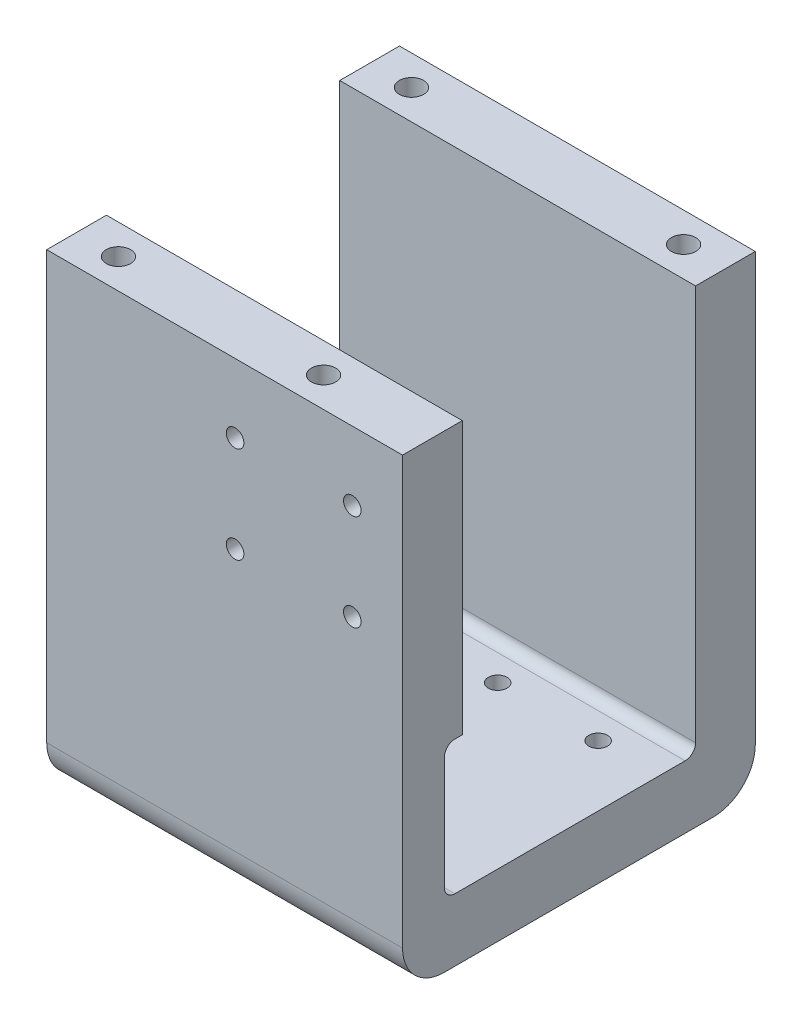
ISO-10303-21;
HEADER;
FILE_DESCRIPTION(('STEP AP214'),'2;1');
FILE_NAME('part.step','',(''),(''),'','','');
FILE_SCHEMA(('AUTOMOTIVE_DESIGN { 1 0 10303 214 1 1 1 1 }'));
ENDSEC;
DATA;
#1=APPLICATION_CONTEXT('core data for automotive mechanical design processes');
#2=APPLICATION_PROTOCOL_DEFINITION('international standard','automotive_design',2000,#1);
#3=PRODUCT_CONTEXT('',#1,'mechanical');
#4=PRODUCT('Part','Part','',(#3));
#5=PRODUCT_RELATED_PRODUCT_CATEGORY('part','',(#4));
#6=PRODUCT_DEFINITION_FORMATION('','',#4);
#7=PRODUCT_DEFINITION_CONTEXT('part definition',#1,'design');
#8=PRODUCT_DEFINITION('design','',#6,#7);
#9=PRODUCT_DEFINITION_SHAPE('','',#8);
#10=(LENGTH_UNIT() NAMED_UNIT(*) SI_UNIT(.MILLI.,.METRE.));
#11=(NAMED_UNIT(*) PLANE_ANGLE_UNIT() SI_UNIT($,.RADIAN.));
#12=(NAMED_UNIT(*) SI_UNIT($,.STERADIAN.) SOLID_ANGLE_UNIT());
#13=UNCERTAINTY_MEASURE_WITH_UNIT(LENGTH_MEASURE(1.E-05),#10,'distance_accuracy_value','');
#14=(GEOMETRIC_REPRESENTATION_CONTEXT(3) GLOBAL_UNCERTAINTY_ASSIGNED_CONTEXT((#13)) GLOBAL_UNIT_ASSIGNED_CONTEXT((#10,
#11,#12)) REPRESENTATION_CONTEXT('',''));
#15=CARTESIAN_POINT('',(0.,0.,0.));
#16=DIRECTION('',(0.,0.,1.));
#17=DIRECTION('',(1.,0.,0.));
#18=AXIS2_PLACEMENT_3D('',#15,#16,#17);
#19=CARTESIAN_POINT('',(0.,0.,30.));
#20=DIRECTION('',(0.,0.,1.));
#21=DIRECTION('',(1.,0.,0.));
#22=AXIS2_PLACEMENT_3D('',#19,#20,#21);
#23=PLANE('',#22);
#24=DIRECTION('',(0.,-1.,0.));
#25=VECTOR('',#24,1.);
#26=CARTESIAN_POINT('',(-42.5,104.5,30.));
#27=LINE('',#26,#25);
#28=CARTESIAN_POINT('',(-42.5,37.,30.));
#29=VERTEX_POINT('',#28);
#30=CARTESIAN_POINT('',(-42.5,10.,30.));
#31=VERTEX_POINT('',#30);
#32=EDGE_CURVE('E193',#29,#31,#27,.T.);
#33=ORIENTED_EDGE('',*,*,#32,.F.);
#34=DIRECTION('',(-1.,0.,0.));
#35=VECTOR('',#34,1.);
#36=CARTESIAN_POINT('',(42.5,37.,30.));
#37=LINE('',#36,#35);
#38=CARTESIAN_POINT('',(42.5,37.,30.));
#39=VERTEX_POINT('',#38);
#40=EDGE_CURVE('E55',#29,#39,#37,.F.);
#41=ORIENTED_EDGE('',*,*,#40,.T.);
#42=DIRECTION('',(0.,1.,0.));
#43=VECTOR('',#42,1.);
#44=CARTESIAN_POINT('',(42.5,104.5,30.));
#45=LINE('',#44,#43);
#46=CARTESIAN_POINT('',(42.5,9.99999999999999,30.));
#47=VERTEX_POINT('',#46);
#48=EDGE_CURVE('E189',#47,#39,#45,.T.);
#49=ORIENTED_EDGE('',*,*,#48,.F.);
#50=DIRECTION('',(1.,0.,0.));
#51=VECTOR('',#50,1.);
#52=CARTESIAN_POINT('',(-42.5,10.,30.));
#53=LINE('',#52,#51);
#54=EDGE_CURVE('E268',#47,#31,#53,.F.);
#55=ORIENTED_EDGE('',*,*,#54,.T.);
#56=EDGE_LOOP('',(#33,#41,#49,#55));
#57=FACE_BOUND('',#56,.T.);
#58=ADVANCED_FACE('F34',(#57),#23,.F.);
#59=CARTESIAN_POINT('',(42.5,7.5,30.));
#60=DIRECTION('',(-1.,0.,0.));
#61=DIRECTION('',(0.,0.,1.));
#62=AXIS2_PLACEMENT_3D('',#59,#60,#61);
#63=PLANE('',#62);
#64=DIRECTION('',(0.,0.,-1.));
#65=VECTOR('',#64,1.);
#66=CARTESIAN_POINT('',(42.5,-7.5,30.));
#67=LINE('',#66,#65);
#68=CARTESIAN_POINT('',(42.5,-7.5,30.));
#69=VERTEX_POINT('',#68);
#70=CARTESIAN_POINT('',(42.5,-7.5,-34.27));
#71=VERTEX_POINT('',#70);
#72=EDGE_CURVE('E226',#69,#71,#67,.T.);
#73=ORIENTED_EDGE('',*,*,#72,.T.);
#74=CARTESIAN_POINT('',(42.5,2.5,-34.27));
#75=DIRECTION('',(-1.,0.,0.));
#76=DIRECTION('',(0.,0.,1.));
#77=AXIS2_PLACEMENT_3D('',#74,#75,#76);
#78=CIRCLE('',#77,10.);
#79=CARTESIAN_POINT('',(42.5,2.5,-44.27));
#80=VERTEX_POINT('',#79);
#81=EDGE_CURVE('E253',#71,#80,#78,.F.);
#82=ORIENTED_EDGE('',*,*,#81,.T.);
#83=DIRECTION('',(0.,-1.,0.));
#84=VECTOR('',#83,1.);
#85=CARTESIAN_POINT('',(42.5,104.5,-44.27));
#86=LINE('',#85,#84);
#87=CARTESIAN_POINT('',(42.5,104.5,-44.27));
#88=VERTEX_POINT('',#87);
#89=EDGE_CURVE('E149',#88,#80,#86,.T.);
#90=ORIENTED_EDGE('',*,*,#89,.F.);
#91=DIRECTION('',(0.,0.,1.));
#92=VECTOR('',#91,1.);
#93=CARTESIAN_POINT('',(42.5,104.5,-44.27));
#94=LINE('',#93,#92);
#95=CARTESIAN_POINT('',(42.5,104.5,-30.));
#96=VERTEX_POINT('',#95);
#97=EDGE_CURVE('E159',#88,#96,#94,.T.);
#98=ORIENTED_EDGE('',*,*,#97,.T.);
#99=DIRECTION('',(0.,-1.,0.));
#100=VECTOR('',#99,1.);
#101=CARTESIAN_POINT('',(42.5,104.5,-30.));
#102=LINE('',#101,#100);
#103=CARTESIAN_POINT('',(42.5,9.99999999999999,-30.));
#104=VERTEX_POINT('',#103);
#105=EDGE_CURVE('E168',#96,#104,#102,.T.);
#106=ORIENTED_EDGE('',*,*,#105,.T.);
#107=CARTESIAN_POINT('',(42.5,10.,-27.5));
#108=DIRECTION('',(-1.,0.,0.));
#109=DIRECTION('',(0.,0.,1.));
#110=AXIS2_PLACEMENT_3D('',#107,#108,#109);
#111=CIRCLE('',#110,2.5);
#112=CARTESIAN_POINT('',(42.5,7.5,-27.5));
#113=VERTEX_POINT('',#112);
#114=EDGE_CURVE('E262',#104,#113,#111,.T.);
#115=ORIENTED_EDGE('',*,*,#114,.T.);
#116=DIRECTION('',(0.,0.,-1.));
#117=VECTOR('',#116,1.);
#118=CARTESIAN_POINT('',(42.5,7.5,30.));
#119=LINE('',#118,#117);
#120=CARTESIAN_POINT('',(42.5,7.5,27.5));
#121=VERTEX_POINT('',#120);
#122=EDGE_CURVE('E229',#121,#113,#119,.T.);
#123=ORIENTED_EDGE('',*,*,#122,.F.);
#124=CARTESIAN_POINT('',(42.5,10.,27.5));
#125=DIRECTION('',(-1.,0.,0.));
#126=DIRECTION('',(0.,0.,1.));
#127=AXIS2_PLACEMENT_3D('',#124,#125,#126);
#128=CIRCLE('',#127,2.5);
#129=EDGE_CURVE('E271',#121,#47,#128,.T.);
#130=ORIENTED_EDGE('',*,*,#129,.T.);
#131=ORIENTED_EDGE('',*,*,#48,.T.);
#132=CARTESIAN_POINT('',(42.5,37.,27.5));
#133=DIRECTION('',(-1.,0.,0.));
#134=DIRECTION('',(0.,0.,1.));
#135=AXIS2_PLACEMENT_3D('',#132,#133,#134);
#136=CIRCLE('',#135,2.5);
#137=CARTESIAN_POINT('',(42.5,39.5,27.5));
#138=VERTEX_POINT('',#137);
#139=EDGE_CURVE('E11',#39,#138,#136,.T.);
#140=ORIENTED_EDGE('',*,*,#139,.T.);
#141=DIRECTION('',(0.,0.,1.));
#142=VECTOR('',#141,1.);
#143=CARTESIAN_POINT('',(42.5,39.5,25.73));
#144=LINE('',#143,#142);
#145=CARTESIAN_POINT('',(42.5,39.5,25.73));
#146=VERTEX_POINT('',#145);
#147=EDGE_CURVE('E186',#146,#138,#144,.T.);
#148=ORIENTED_EDGE('',*,*,#147,.F.);
#149=DIRECTION('',(0.,-1.,0.));
#150=VECTOR('',#149,1.);
#151=CARTESIAN_POINT('',(42.5,39.5,25.73));
#152=LINE('',#151,#150);
#153=CARTESIAN_POINT('',(42.5,104.5,25.73));
#154=VERTEX_POINT('',#153);
#155=EDGE_CURVE('E180',#154,#146,#152,.T.);
#156=ORIENTED_EDGE('',*,*,#155,.F.);
#157=DIRECTION('',(0.,0.,-1.));
#158=VECTOR('',#157,1.);
#159=CARTESIAN_POINT('',(42.5,104.5,40.));
#160=LINE('',#159,#158);
#161=CARTESIAN_POINT('',(42.5,104.5,40.));
#162=VERTEX_POINT('',#161);
#163=EDGE_CURVE('E202',#162,#154,#160,.T.);
#164=ORIENTED_EDGE('',*,*,#163,.F.);
#165=DIRECTION('',(0.,1.,0.));
#166=VECTOR('',#165,1.);
#167=CARTESIAN_POINT('',(42.5,104.5,40.));
#168=LINE('',#167,#166);
#169=CARTESIAN_POINT('',(42.5,2.5,40.));
#170=VERTEX_POINT('',#169);
#171=EDGE_CURVE('E190',#170,#162,#168,.T.);
#172=ORIENTED_EDGE('',*,*,#171,.F.);
#173=CARTESIAN_POINT('',(42.5,2.5,30.));
#174=DIRECTION('',(-1.,0.,0.));
#175=DIRECTION('',(0.,0.,1.));
#176=AXIS2_PLACEMENT_3D('',#173,#174,#175);
#177=CIRCLE('',#176,10.);
#178=EDGE_CURVE('E241',#170,#69,#177,.F.);
#179=ORIENTED_EDGE('',*,*,#178,.T.);
#180=EDGE_LOOP('',(#73,#82,#90,#98,#106,#115,#123,#130,#131,#140,#148,#156,#164,#172,#179));
#181=FACE_BOUND('',#180,.T.);
#182=ADVANCED_FACE('F295',(#181),#63,.F.);
#183=CARTESIAN_POINT('',(-42.5,7.5,30.));
#184=DIRECTION('',(1.,0.,0.));
#185=DIRECTION('',(0.,0.,-1.));
#186=AXIS2_PLACEMENT_3D('',#183,#184,#185);
#187=PLANE('',#186);
#188=CARTESIAN_POINT('',(-42.5,58.5,-37.135));
#189=DIRECTION('',(-1.,0.,0.));
#190=DIRECTION('',(0.,0.,1.));
#191=AXIS2_PLACEMENT_3D('',#188,#189,#190);
#192=CIRCLE('',#191,2.9);
#193=CARTESIAN_POINT('',(-42.5,58.5,-34.235));
#194=VERTEX_POINT('',#193);
#195=EDGE_CURVE('E663',#194,#194,#192,.T.);
#196=ORIENTED_EDGE('',*,*,#195,.F.);
#197=EDGE_LOOP('',(#196));
#198=FACE_BOUND('',#197,.T.);
#199=CARTESIAN_POINT('',(-42.5,58.5,32.865));
#200=DIRECTION('',(-1.,0.,0.));
#201=DIRECTION('',(0.,0.,1.));
#202=AXIS2_PLACEMENT_3D('',#199,#200,#201);
#203=CIRCLE('',#202,2.9);
#204=CARTESIAN_POINT('',(-42.5,58.5,35.765));
#205=VERTEX_POINT('',#204);
#206=EDGE_CURVE('E657',#205,#205,#203,.T.);
#207=ORIENTED_EDGE('',*,*,#206,.F.);
#208=EDGE_LOOP('',(#207));
#209=FACE_BOUND('',#208,.T.);
#210=CARTESIAN_POINT('',(-42.5,0.,-2.135));
#211=DIRECTION('',(-1.,0.,0.));
#212=DIRECTION('',(0.,0.,1.));
#213=AXIS2_PLACEMENT_3D('',#210,#211,#212);
#214=CIRCLE('',#213,2.9);
#215=CARTESIAN_POINT('',(-42.5,0.,0.765000000000002));
#216=VERTEX_POINT('',#215);
#217=EDGE_CURVE('E651',#216,#216,#214,.T.);
#218=ORIENTED_EDGE('',*,*,#217,.F.);
#219=EDGE_LOOP('',(#218));
#220=FACE_BOUND('',#219,.T.);
#221=DIRECTION('',(0.,1.,0.));
#222=VECTOR('',#221,1.);
#223=CARTESIAN_POINT('',(-42.5,104.5,-44.27));
#224=LINE('',#223,#222);
#225=CARTESIAN_POINT('',(-42.5,2.5,-44.27));
#226=VERTEX_POINT('',#225);
#227=CARTESIAN_POINT('',(-42.5,104.5,-44.27));
#228=VERTEX_POINT('',#227);
#229=EDGE_CURVE('E140',#226,#228,#224,.T.);
#230=ORIENTED_EDGE('',*,*,#229,.F.);
#231=CARTESIAN_POINT('',(-42.5,2.5,-34.27));
#232=DIRECTION('',(1.,0.,0.));
#233=DIRECTION('',(0.,0.,-1.));
#234=AXIS2_PLACEMENT_3D('',#231,#232,#233);
#235=CIRCLE('',#234,10.);
#236=CARTESIAN_POINT('',(-42.5,-7.5,-34.27));
#237=VERTEX_POINT('',#236);
#238=EDGE_CURVE('E249',#226,#237,#235,.F.);
#239=ORIENTED_EDGE('',*,*,#238,.T.);
#240=DIRECTION('',(0.,0.,1.));
#241=VECTOR('',#240,1.);
#242=CARTESIAN_POINT('',(-42.5,-7.5,30.));
#243=LINE('',#242,#241);
#244=CARTESIAN_POINT('',(-42.5,-7.5,30.));
#245=VERTEX_POINT('',#244);
#246=EDGE_CURVE('E232',#237,#245,#243,.T.);
#247=ORIENTED_EDGE('',*,*,#246,.T.);
#248=CARTESIAN_POINT('',(-42.5,2.5,30.));
#249=DIRECTION('',(1.,0.,0.));
#250=DIRECTION('',(0.,0.,-1.));
#251=AXIS2_PLACEMENT_3D('',#248,#249,#250);
#252=CIRCLE('',#251,10.);
#253=CARTESIAN_POINT('',(-42.5,2.50000000000003,40.));
#254=VERTEX_POINT('',#253);
#255=EDGE_CURVE('E246',#245,#254,#252,.F.);
#256=ORIENTED_EDGE('',*,*,#255,.T.);
#257=DIRECTION('',(0.,-1.,0.));
#258=VECTOR('',#257,1.);
#259=CARTESIAN_POINT('',(-42.5,104.5,40.));
#260=LINE('',#259,#258);
#261=CARTESIAN_POINT('',(-42.5,104.5,40.));
#262=VERTEX_POINT('',#261);
#263=EDGE_CURVE('E195',#262,#254,#260,.T.);
#264=ORIENTED_EDGE('',*,*,#263,.F.);
#265=DIRECTION('',(0.,0.,-1.));
#266=VECTOR('',#265,1.);
#267=CARTESIAN_POINT('',(-42.5,104.5,40.));
#268=LINE('',#267,#266);
#269=CARTESIAN_POINT('',(-42.5,104.5,25.73));
#270=VERTEX_POINT('',#269);
#271=EDGE_CURVE('E198',#262,#270,#268,.T.);
#272=ORIENTED_EDGE('',*,*,#271,.T.);
#273=DIRECTION('',(0.,1.,0.));
#274=VECTOR('',#273,1.);
#275=CARTESIAN_POINT('',(-42.5,39.5,25.73));
#276=LINE('',#275,#274);
#277=CARTESIAN_POINT('',(-42.5,39.5,25.73));
#278=VERTEX_POINT('',#277);
#279=EDGE_CURVE('E158',#278,#270,#276,.T.);
#280=ORIENTED_EDGE('',*,*,#279,.F.);
#281=DIRECTION('',(0.,0.,1.));
#282=VECTOR('',#281,1.);
#283=CARTESIAN_POINT('',(-42.5,39.5,25.73));
#284=LINE('',#283,#282);
#285=CARTESIAN_POINT('',(-42.5,39.5,27.5));
#286=VERTEX_POINT('',#285);
#287=EDGE_CURVE('E184',#278,#286,#284,.T.);
#288=ORIENTED_EDGE('',*,*,#287,.T.);
#289=CARTESIAN_POINT('',(-42.5,37.,27.5));
#290=DIRECTION('',(1.,0.,0.));
#291=DIRECTION('',(0.,0.,-1.));
#292=AXIS2_PLACEMENT_3D('',#289,#290,#291);
#293=CIRCLE('',#292,2.5);
#294=EDGE_CURVE('E42',#286,#29,#293,.T.);
#295=ORIENTED_EDGE('',*,*,#294,.T.);
#296=ORIENTED_EDGE('',*,*,#32,.T.);
#297=CARTESIAN_POINT('',(-42.5,10.,27.5));
#298=DIRECTION('',(1.,0.,0.));
#299=DIRECTION('',(0.,0.,-1.));
#300=AXIS2_PLACEMENT_3D('',#297,#298,#299);
#301=CIRCLE('',#300,2.5);
#302=CARTESIAN_POINT('',(-42.5,7.5,27.5));
#303=VERTEX_POINT('',#302);
#304=EDGE_CURVE('E273',#31,#303,#301,.T.);
#305=ORIENTED_EDGE('',*,*,#304,.T.);
#306=DIRECTION('',(0.,0.,1.));
#307=VECTOR('',#306,1.);
#308=CARTESIAN_POINT('',(-42.5,7.5,30.));
#309=LINE('',#308,#307);
#310=CARTESIAN_POINT('',(-42.5,7.5,-27.5));
#311=VERTEX_POINT('',#310);
#312=EDGE_CURVE('E231',#311,#303,#309,.T.);
#313=ORIENTED_EDGE('',*,*,#312,.F.);
#314=CARTESIAN_POINT('',(-42.5,10.,-27.5));
#315=DIRECTION('',(1.,0.,0.));
#316=DIRECTION('',(0.,0.,-1.));
#317=AXIS2_PLACEMENT_3D('',#314,#315,#316);
#318=CIRCLE('',#317,2.5);
#319=CARTESIAN_POINT('',(-42.5,9.99999999999999,-30.));
#320=VERTEX_POINT('',#319);
#321=EDGE_CURVE('E260',#311,#320,#318,.T.);
#322=ORIENTED_EDGE('',*,*,#321,.T.);
#323=DIRECTION('',(0.,1.,0.));
#324=VECTOR('',#323,1.);
#325=CARTESIAN_POINT('',(-42.5,104.5,-30.));
#326=LINE('',#325,#324);
#327=CARTESIAN_POINT('',(-42.5,104.5,-30.));
#328=VERTEX_POINT('',#327);
#329=EDGE_CURVE('E155',#320,#328,#326,.T.);
#330=ORIENTED_EDGE('',*,*,#329,.T.);
#331=DIRECTION('',(0.,0.,1.));
#332=VECTOR('',#331,1.);
#333=CARTESIAN_POINT('',(-42.5,104.5,-44.27));
#334=LINE('',#333,#332);
#335=EDGE_CURVE('E152',#228,#328,#334,.T.);
#336=ORIENTED_EDGE('',*,*,#335,.F.);
#337=EDGE_LOOP('',(#230,#239,#247,#256,#264,#272,#280,#288,#295,#296,#305,#313,#322,#330,#336));
#338=FACE_BOUND('',#337,.T.);
#339=ADVANCED_FACE('F153',(#198,#209,#220,#338),#187,.F.);
#340=CARTESIAN_POINT('',(0.,7.5,0.));
#341=DIRECTION('',(0.,-1.,0.));
#342=DIRECTION('',(0.,0.,-1.));
#343=AXIS2_PLACEMENT_3D('',#340,#341,#342);
#344=PLANE('',#343);
#345=CARTESIAN_POINT('',(3.95000000000001,7.5,-21.27));
#346=DIRECTION('',(0.,1.,0.));
#347=DIRECTION('',(0.,0.,1.));
#348=AXIS2_PLACEMENT_3D('',#345,#346,#347);
#349=CIRCLE('',#348,2.25);
#350=CARTESIAN_POINT('',(3.95000000000001,7.5,-19.02));
#351=VERTEX_POINT('',#350);
#352=EDGE_CURVE('E215',#351,#351,#349,.T.);
#353=ORIENTED_EDGE('',*,*,#352,.F.);
#354=EDGE_LOOP('',(#353));
#355=FACE_BOUND('',#354,.T.);
#356=CARTESIAN_POINT('',(27.95,7.5,20.73));
#357=DIRECTION('',(0.,1.,0.));
#358=DIRECTION('',(0.,0.,1.));
#359=AXIS2_PLACEMENT_3D('',#356,#357,#358);
#360=CIRCLE('',#359,2.25000000000002);
#361=CARTESIAN_POINT('',(27.95,7.5,22.98));
#362=VERTEX_POINT('',#361);
#363=EDGE_CURVE('E208',#362,#362,#360,.T.);
#364=ORIENTED_EDGE('',*,*,#363,.F.);
#365=EDGE_LOOP('',(#364));
#366=FACE_BOUND('',#365,.T.);
#367=CARTESIAN_POINT('',(27.95,7.5,-21.27));
#368=DIRECTION('',(0.,1.,0.));
#369=DIRECTION('',(0.,0.,1.));
#370=AXIS2_PLACEMENT_3D('',#367,#368,#369);
#371=CIRCLE('',#370,2.25);
#372=CARTESIAN_POINT('',(27.95,7.5,-19.02));
#373=VERTEX_POINT('',#372);
#374=EDGE_CURVE('E204',#373,#373,#371,.T.);
#375=ORIENTED_EDGE('',*,*,#374,.F.);
#376=EDGE_LOOP('',(#375));
#377=FACE_BOUND('',#376,.T.);
#378=CARTESIAN_POINT('',(3.95000000000001,7.5,20.73));
#379=DIRECTION('',(0.,1.,0.));
#380=DIRECTION('',(0.,0.,1.));
#381=AXIS2_PLACEMENT_3D('',#378,#379,#380);
#382=CIRCLE('',#381,2.25);
#383=CARTESIAN_POINT('',(3.95000000000001,7.5,22.98));
#384=VERTEX_POINT('',#383);
#385=EDGE_CURVE('E214',#384,#384,#382,.T.);
#386=ORIENTED_EDGE('',*,*,#385,.F.);
#387=EDGE_LOOP('',(#386));
#388=FACE_BOUND('',#387,.T.);
#389=ORIENTED_EDGE('',*,*,#312,.T.);
#390=DIRECTION('',(1.,0.,0.));
#391=VECTOR('',#390,1.);
#392=CARTESIAN_POINT('',(42.5,7.5,27.5));
#393=LINE('',#392,#391);
#394=EDGE_CURVE('E265',#303,#121,#393,.T.);
#395=ORIENTED_EDGE('',*,*,#394,.T.);
#396=ORIENTED_EDGE('',*,*,#122,.T.);
#397=DIRECTION('',(-1.,0.,0.));
#398=VECTOR('',#397,1.);
#399=CARTESIAN_POINT('',(-42.5,7.5,-27.5));
#400=LINE('',#399,#398);
#401=EDGE_CURVE('E255',#113,#311,#400,.T.);
#402=ORIENTED_EDGE('',*,*,#401,.T.);
#403=EDGE_LOOP('',(#389,#395,#396,#402));
#404=FACE_BOUND('',#403,.T.);
#405=ADVANCED_FACE('F339',(#355,#366,#377,#388,#404),#344,.F.);
#406=CARTESIAN_POINT('',(0.,-7.5,0.));
#407=DIRECTION('',(0.,-1.,0.));
#408=DIRECTION('',(0.,0.,-1.));
#409=AXIS2_PLACEMENT_3D('',#406,#407,#408);
#410=PLANE('',#409);
#411=CARTESIAN_POINT('',(3.95000000000001,-7.5,-21.27));
#412=DIRECTION('',(0.,1.,0.));
#413=DIRECTION('',(0.,0.,1.));
#414=AXIS2_PLACEMENT_3D('',#411,#412,#413);
#415=CIRCLE('',#414,2.25);
#416=CARTESIAN_POINT('',(3.95000000000001,-7.5,-19.02));
#417=VERTEX_POINT('',#416);
#418=EDGE_CURVE('E211',#417,#417,#415,.T.);
#419=ORIENTED_EDGE('',*,*,#418,.T.);
#420=EDGE_LOOP('',(#419));
#421=FACE_BOUND('',#420,.T.);
#422=CARTESIAN_POINT('',(27.95,-7.5,20.73));
#423=DIRECTION('',(0.,1.,0.));
#424=DIRECTION('',(0.,0.,1.));
#425=AXIS2_PLACEMENT_3D('',#422,#423,#424);
#426=CIRCLE('',#425,2.25000000000002);
#427=CARTESIAN_POINT('',(27.95,-7.5,22.98));
#428=VERTEX_POINT('',#427);
#429=EDGE_CURVE('E218',#428,#428,#426,.T.);
#430=ORIENTED_EDGE('',*,*,#429,.T.);
#431=EDGE_LOOP('',(#430));
#432=FACE_BOUND('',#431,.T.);
#433=CARTESIAN_POINT('',(27.95,-7.5,-21.27));
#434=DIRECTION('',(0.,1.,0.));
#435=DIRECTION('',(0.,0.,1.));
#436=AXIS2_PLACEMENT_3D('',#433,#434,#435);
#437=CIRCLE('',#436,2.25);
#438=CARTESIAN_POINT('',(27.95,-7.5,-19.02));
#439=VERTEX_POINT('',#438);
#440=EDGE_CURVE('E205',#439,#439,#437,.T.);
#441=ORIENTED_EDGE('',*,*,#440,.T.);
#442=EDGE_LOOP('',(#441));
#443=FACE_BOUND('',#442,.T.);
#444=CARTESIAN_POINT('',(3.95000000000001,-7.5,20.73));
#445=DIRECTION('',(0.,1.,0.));
#446=DIRECTION('',(0.,0.,1.));
#447=AXIS2_PLACEMENT_3D('',#444,#445,#446);
#448=CIRCLE('',#447,2.25);
#449=CARTESIAN_POINT('',(3.95000000000001,-7.5,22.98));
#450=VERTEX_POINT('',#449);
#451=EDGE_CURVE('E223',#450,#450,#448,.T.);
#452=ORIENTED_EDGE('',*,*,#451,.T.);
#453=EDGE_LOOP('',(#452));
#454=FACE_BOUND('',#453,.T.);
#455=ORIENTED_EDGE('',*,*,#246,.F.);
#456=DIRECTION('',(-1.,0.,0.));
#457=VECTOR('',#456,1.);
#458=CARTESIAN_POINT('',(0.,-7.5,-34.27));
#459=LINE('',#458,#457);
#460=EDGE_CURVE('E251',#237,#71,#459,.F.);
#461=ORIENTED_EDGE('',*,*,#460,.T.);
#462=ORIENTED_EDGE('',*,*,#72,.F.);
#463=DIRECTION('',(1.,0.,0.));
#464=VECTOR('',#463,1.);
#465=CARTESIAN_POINT('',(0.,-7.5,30.));
#466=LINE('',#465,#464);
#467=EDGE_CURVE('E243',#69,#245,#466,.F.);
#468=ORIENTED_EDGE('',*,*,#467,.T.);
#469=EDGE_LOOP('',(#455,#461,#462,#468));
#470=FACE_BOUND('',#469,.T.);
#471=ADVANCED_FACE('F337',(#421,#432,#443,#454,#470),#410,.T.);
#472=CARTESIAN_POINT('',(3.95000000000001,-7.5,20.73));
#473=DIRECTION('',(0.,1.,0.));
#474=DIRECTION('',(0.,0.,1.));
#475=AXIS2_PLACEMENT_3D('',#472,#473,#474);
#476=CYLINDRICAL_SURFACE('',#475,2.25);
#477=ORIENTED_EDGE('',*,*,#451,.F.);
#478=EDGE_LOOP('',(#477));
#479=FACE_BOUND('',#478,.T.);
#480=ORIENTED_EDGE('',*,*,#385,.T.);
#481=EDGE_LOOP('',(#480));
#482=FACE_BOUND('',#481,.T.);
#483=ADVANCED_FACE('F327',(#479,#482),#476,.F.);
#484=CARTESIAN_POINT('',(27.95,-7.5,-21.27));
#485=DIRECTION('',(0.,1.,0.));
#486=DIRECTION('',(0.,0.,1.));
#487=AXIS2_PLACEMENT_3D('',#484,#485,#486);
#488=CYLINDRICAL_SURFACE('',#487,2.25);
#489=ORIENTED_EDGE('',*,*,#440,.F.);
#490=EDGE_LOOP('',(#489));
#491=FACE_BOUND('',#490,.T.);
#492=ORIENTED_EDGE('',*,*,#374,.T.);
#493=EDGE_LOOP('',(#492));
#494=FACE_BOUND('',#493,.T.);
#495=ADVANCED_FACE('F323',(#491,#494),#488,.F.);
#496=CARTESIAN_POINT('',(27.95,-7.5,20.73));
#497=DIRECTION('',(0.,1.,0.));
#498=DIRECTION('',(0.,0.,1.));
#499=AXIS2_PLACEMENT_3D('',#496,#497,#498);
#500=CYLINDRICAL_SURFACE('',#499,2.25000000000002);
#501=ORIENTED_EDGE('',*,*,#429,.F.);
#502=EDGE_LOOP('',(#501));
#503=FACE_BOUND('',#502,.T.);
#504=ORIENTED_EDGE('',*,*,#363,.T.);
#505=EDGE_LOOP('',(#504));
#506=FACE_BOUND('',#505,.T.);
#507=ADVANCED_FACE('F326',(#503,#506),#500,.F.);
#508=CARTESIAN_POINT('',(3.95000000000001,-7.5,-21.27));
#509=DIRECTION('',(0.,1.,0.));
#510=DIRECTION('',(0.,0.,1.));
#511=AXIS2_PLACEMENT_3D('',#508,#509,#510);
#512=CYLINDRICAL_SURFACE('',#511,2.25);
#513=ORIENTED_EDGE('',*,*,#418,.F.);
#514=EDGE_LOOP('',(#513));
#515=FACE_BOUND('',#514,.T.);
#516=ORIENTED_EDGE('',*,*,#352,.T.);
#517=EDGE_LOOP('',(#516));
#518=FACE_BOUND('',#517,.T.);
#519=ADVANCED_FACE('F321',(#515,#518),#512,.F.);
#520=CARTESIAN_POINT('',(42.5,104.5,40.));
#521=DIRECTION('',(0.,-1.,0.));
#522=DIRECTION('',(1.,0.,0.));
#523=AXIS2_PLACEMENT_3D('',#520,#521,#522);
#524=PLANE('',#523);
#525=CARTESIAN_POINT('',(16.5,104.5,32.865));
#526=DIRECTION('',(0.,1.,0.));
#527=DIRECTION('',(0.,0.,1.));
#528=AXIS2_PLACEMENT_3D('',#525,#526,#527);
#529=CIRCLE('',#528,2.9);
#530=CARTESIAN_POINT('',(16.5,104.5,35.765));
#531=VERTEX_POINT('',#530);
#532=EDGE_CURVE('E627',#531,#531,#529,.T.);
#533=ORIENTED_EDGE('',*,*,#532,.F.);
#534=EDGE_LOOP('',(#533));
#535=FACE_BOUND('',#534,.T.);
#536=CARTESIAN_POINT('',(-32.5,104.5,32.865));
#537=DIRECTION('',(0.,1.,0.));
#538=DIRECTION('',(0.,0.,1.));
#539=AXIS2_PLACEMENT_3D('',#536,#537,#538);
#540=CIRCLE('',#539,2.9);
#541=CARTESIAN_POINT('',(-32.5,104.5,35.765));
#542=VERTEX_POINT('',#541);
#543=EDGE_CURVE('E570',#542,#542,#540,.T.);
#544=ORIENTED_EDGE('',*,*,#543,.F.);
#545=EDGE_LOOP('',(#544));
#546=FACE_BOUND('',#545,.T.);
#547=ORIENTED_EDGE('',*,*,#163,.T.);
#548=DIRECTION('',(1.,0.,0.));
#549=VECTOR('',#548,1.);
#550=CARTESIAN_POINT('',(-42.5,104.5,25.73));
#551=LINE('',#550,#549);
#552=EDGE_CURVE('E177',#270,#154,#551,.T.);
#553=ORIENTED_EDGE('',*,*,#552,.F.);
#554=ORIENTED_EDGE('',*,*,#271,.F.);
#555=DIRECTION('',(-1.,0.,0.));
#556=VECTOR('',#555,1.);
#557=CARTESIAN_POINT('',(42.5,104.5,40.));
#558=LINE('',#557,#556);
#559=EDGE_CURVE('E192',#162,#262,#558,.T.);
#560=ORIENTED_EDGE('',*,*,#559,.F.);
#561=EDGE_LOOP('',(#547,#553,#554,#560));
#562=FACE_BOUND('',#561,.T.);
#563=ADVANCED_FACE('F318',(#535,#546,#562),#524,.F.);
#564=CARTESIAN_POINT('',(0.,0.,40.));
#565=DIRECTION('',(0.,0.,1.));
#566=DIRECTION('',(1.,0.,0.));
#567=AXIS2_PLACEMENT_3D('',#564,#565,#566);
#568=PLANE('',#567);
#569=CARTESIAN_POINT('',(2.50000000000002,88.06,40.));
#570=DIRECTION('',(0.,0.,1.));
#571=DIRECTION('',(1.,0.,0.));
#572=AXIS2_PLACEMENT_3D('',#569,#570,#571);
#573=CIRCLE('',#572,2.1);
#574=CARTESIAN_POINT('',(4.60000000000002,88.06,40.));
#575=VERTEX_POINT('',#574);
#576=EDGE_CURVE('E597',#575,#575,#573,.T.);
#577=ORIENTED_EDGE('',*,*,#576,.F.);
#578=EDGE_LOOP('',(#577));
#579=FACE_BOUND('',#578,.T.);
#580=CARTESIAN_POINT('',(2.50000000000002,65.06,40.));
#581=DIRECTION('',(0.,0.,1.));
#582=DIRECTION('',(1.,0.,0.));
#583=AXIS2_PLACEMENT_3D('',#580,#581,#582);
#584=CIRCLE('',#583,2.1);
#585=CARTESIAN_POINT('',(4.60000000000002,65.06,40.));
#586=VERTEX_POINT('',#585);
#587=EDGE_CURVE('E601',#586,#586,#584,.T.);
#588=ORIENTED_EDGE('',*,*,#587,.F.);
#589=EDGE_LOOP('',(#588));
#590=FACE_BOUND('',#589,.T.);
#591=CARTESIAN_POINT('',(30.5,65.06,40.));
#592=DIRECTION('',(0.,0.,1.));
#593=DIRECTION('',(1.,0.,0.));
#594=AXIS2_PLACEMENT_3D('',#591,#592,#593);
#595=CIRCLE('',#594,2.1);
#596=CARTESIAN_POINT('',(32.6,65.06,40.));
#597=VERTEX_POINT('',#596);
#598=EDGE_CURVE('E605',#597,#597,#595,.T.);
#599=ORIENTED_EDGE('',*,*,#598,.F.);
#600=EDGE_LOOP('',(#599));
#601=FACE_BOUND('',#600,.T.);
#602=CARTESIAN_POINT('',(30.5,88.06,40.));
#603=DIRECTION('',(0.,0.,1.));
#604=DIRECTION('',(1.,0.,0.));
#605=AXIS2_PLACEMENT_3D('',#602,#603,#604);
#606=CIRCLE('',#605,2.1);
#607=CARTESIAN_POINT('',(32.6,88.06,40.));
#608=VERTEX_POINT('',#607);
#609=EDGE_CURVE('E608',#608,#608,#606,.T.);
#610=ORIENTED_EDGE('',*,*,#609,.F.);
#611=EDGE_LOOP('',(#610));
#612=FACE_BOUND('',#611,.T.);
#613=ORIENTED_EDGE('',*,*,#263,.T.);
#614=DIRECTION('',(1.,0.,0.));
#615=VECTOR('',#614,1.);
#616=CARTESIAN_POINT('',(0.,2.5,40.));
#617=LINE('',#616,#615);
#618=EDGE_CURVE('E235',#254,#170,#617,.T.);
#619=ORIENTED_EDGE('',*,*,#618,.T.);
#620=ORIENTED_EDGE('',*,*,#171,.T.);
#621=ORIENTED_EDGE('',*,*,#559,.T.);
#622=EDGE_LOOP('',(#613,#619,#620,#621));
#623=FACE_BOUND('',#622,.T.);
#624=ADVANCED_FACE('F316',(#579,#590,#601,#612,#623),#568,.T.);
#625=CARTESIAN_POINT('',(0.,2.5,30.));
#626=DIRECTION('',(1.,0.,0.));
#627=DIRECTION('',(0.,0.,-1.));
#628=AXIS2_PLACEMENT_3D('',#625,#626,#627);
#629=CYLINDRICAL_SURFACE('',#628,10.);
#630=ORIENTED_EDGE('',*,*,#255,.F.);
#631=ORIENTED_EDGE('',*,*,#467,.F.);
#632=ORIENTED_EDGE('',*,*,#178,.F.);
#633=ORIENTED_EDGE('',*,*,#618,.F.);
#634=EDGE_LOOP('',(#630,#631,#632,#633));
#635=FACE_BOUND('',#634,.T.);
#636=ADVANCED_FACE('F349',(#635),#629,.T.);
#637=CARTESIAN_POINT('',(-42.5,39.5,25.73));
#638=DIRECTION('',(0.,1.,0.));
#639=DIRECTION('',(-1.,0.,0.));
#640=AXIS2_PLACEMENT_3D('',#637,#638,#639);
#641=PLANE('',#640);
#642=ORIENTED_EDGE('',*,*,#147,.T.);
#643=DIRECTION('',(-1.,0.,0.));
#644=VECTOR('',#643,1.);
#645=CARTESIAN_POINT('',(-42.5,39.5,27.5));
#646=LINE('',#645,#644);
#647=EDGE_CURVE('E275',#138,#286,#646,.T.);
#648=ORIENTED_EDGE('',*,*,#647,.T.);
#649=ORIENTED_EDGE('',*,*,#287,.F.);
#650=DIRECTION('',(-1.,0.,0.));
#651=VECTOR('',#650,1.);
#652=CARTESIAN_POINT('',(-42.5,39.5,25.73));
#653=LINE('',#652,#651);
#654=EDGE_CURVE('E182',#146,#278,#653,.T.);
#655=ORIENTED_EDGE('',*,*,#654,.F.);
#656=EDGE_LOOP('',(#642,#648,#649,#655));
#657=FACE_BOUND('',#656,.T.);
#658=ADVANCED_FACE('F281',(#657),#641,.F.);
#659=CARTESIAN_POINT('',(0.,0.,25.73));
#660=DIRECTION('',(0.,0.,-1.));
#661=DIRECTION('',(-1.,0.,0.));
#662=AXIS2_PLACEMENT_3D('',#659,#660,#661);
#663=PLANE('',#662);
#664=CARTESIAN_POINT('',(2.50000000000002,88.06,25.73));
#665=DIRECTION('',(0.,0.,-1.));
#666=DIRECTION('',(-1.,0.,0.));
#667=AXIS2_PLACEMENT_3D('',#664,#665,#666);
#668=CIRCLE('',#667,2.1);
#669=CARTESIAN_POINT('',(0.400000000000018,88.06,25.73));
#670=VERTEX_POINT('',#669);
#671=EDGE_CURVE('E616',#670,#670,#668,.F.);
#672=ORIENTED_EDGE('',*,*,#671,.T.);
#673=EDGE_LOOP('',(#672));
#674=FACE_BOUND('',#673,.T.);
#675=CARTESIAN_POINT('',(2.50000000000002,65.06,25.73));
#676=DIRECTION('',(0.,0.,-1.));
#677=DIRECTION('',(-1.,0.,0.));
#678=AXIS2_PLACEMENT_3D('',#675,#676,#677);
#679=CIRCLE('',#678,2.1);
#680=CARTESIAN_POINT('',(0.400000000000018,65.06,25.73));
#681=VERTEX_POINT('',#680);
#682=EDGE_CURVE('E646',#681,#681,#679,.F.);
#683=ORIENTED_EDGE('',*,*,#682,.T.);
#684=EDGE_LOOP('',(#683));
#685=FACE_BOUND('',#684,.T.);
#686=CARTESIAN_POINT('',(30.5,65.06,25.73));
#687=DIRECTION('',(0.,0.,-1.));
#688=DIRECTION('',(-1.,0.,0.));
#689=AXIS2_PLACEMENT_3D('',#686,#687,#688);
#690=CIRCLE('',#689,2.1);
#691=CARTESIAN_POINT('',(28.4,65.06,25.73));
#692=VERTEX_POINT('',#691);
#693=EDGE_CURVE('E609',#692,#692,#690,.F.);
#694=ORIENTED_EDGE('',*,*,#693,.T.);
#695=EDGE_LOOP('',(#694));
#696=FACE_BOUND('',#695,.T.);
#697=CARTESIAN_POINT('',(30.5,88.06,25.73));
#698=DIRECTION('',(0.,0.,-1.));
#699=DIRECTION('',(-1.,0.,0.));
#700=AXIS2_PLACEMENT_3D('',#697,#698,#699);
#701=CIRCLE('',#700,2.1);
#702=CARTESIAN_POINT('',(28.4,88.06,25.73));
#703=VERTEX_POINT('',#702);
#704=EDGE_CURVE('E577',#703,#703,#701,.F.);
#705=ORIENTED_EDGE('',*,*,#704,.T.);
#706=EDGE_LOOP('',(#705));
#707=FACE_BOUND('',#706,.T.);
#708=ORIENTED_EDGE('',*,*,#279,.T.);
#709=ORIENTED_EDGE('',*,*,#552,.T.);
#710=ORIENTED_EDGE('',*,*,#155,.T.);
#711=ORIENTED_EDGE('',*,*,#654,.T.);
#712=EDGE_LOOP('',(#708,#709,#710,#711));
#713=FACE_BOUND('',#712,.T.);
#714=ADVANCED_FACE('F291',(#674,#685,#696,#707,#713),#663,.T.);
#715=CARTESIAN_POINT('',(42.5,104.5,-44.27));
#716=DIRECTION('',(0.,-1.,0.));
#717=DIRECTION('',(0.,0.,-1.));
#718=AXIS2_PLACEMENT_3D('',#715,#716,#717);
#719=PLANE('',#718);
#720=CARTESIAN_POINT('',(32.5,104.5,-37.135));
#721=DIRECTION('',(0.,1.,0.));
#722=DIRECTION('',(0.,0.,1.));
#723=AXIS2_PLACEMENT_3D('',#720,#721,#722);
#724=CIRCLE('',#723,2.9);
#725=CARTESIAN_POINT('',(32.5,104.5,-34.235));
#726=VERTEX_POINT('',#725);
#727=EDGE_CURVE('E621',#726,#726,#724,.T.);
#728=ORIENTED_EDGE('',*,*,#727,.F.);
#729=EDGE_LOOP('',(#728));
#730=FACE_BOUND('',#729,.T.);
#731=CARTESIAN_POINT('',(-32.5,104.5,-37.135));
#732=DIRECTION('',(0.,1.,0.));
#733=DIRECTION('',(0.,0.,1.));
#734=AXIS2_PLACEMENT_3D('',#731,#732,#733);
#735=CIRCLE('',#734,2.9);
#736=CARTESIAN_POINT('',(-32.5,104.5,-34.235));
#737=VERTEX_POINT('',#736);
#738=EDGE_CURVE('E571',#737,#737,#735,.T.);
#739=ORIENTED_EDGE('',*,*,#738,.F.);
#740=EDGE_LOOP('',(#739));
#741=FACE_BOUND('',#740,.T.);
#742=DIRECTION('',(1.,0.,0.));
#743=VECTOR('',#742,1.);
#744=CARTESIAN_POINT('',(42.5,104.5,-30.));
#745=LINE('',#744,#743);
#746=EDGE_CURVE('E173',#328,#96,#745,.T.);
#747=ORIENTED_EDGE('',*,*,#746,.T.);
#748=ORIENTED_EDGE('',*,*,#97,.F.);
#749=DIRECTION('',(1.,0.,0.));
#750=VECTOR('',#749,1.);
#751=CARTESIAN_POINT('',(42.5,104.5,-44.27));
#752=LINE('',#751,#750);
#753=EDGE_CURVE('E145',#228,#88,#752,.T.);
#754=ORIENTED_EDGE('',*,*,#753,.F.);
#755=ORIENTED_EDGE('',*,*,#335,.T.);
#756=EDGE_LOOP('',(#747,#748,#754,#755));
#757=FACE_BOUND('',#756,.T.);
#758=ADVANCED_FACE('F161',(#730,#741,#757),#719,.F.);
#759=CARTESIAN_POINT('',(0.,0.,-44.27));
#760=DIRECTION('',(0.,0.,-1.));
#761=DIRECTION('',(-1.,0.,0.));
#762=AXIS2_PLACEMENT_3D('',#759,#760,#761);
#763=PLANE('',#762);
#764=ORIENTED_EDGE('',*,*,#89,.T.);
#765=DIRECTION('',(-1.,0.,0.));
#766=VECTOR('',#765,1.);
#767=CARTESIAN_POINT('',(0.,2.5,-44.27));
#768=LINE('',#767,#766);
#769=EDGE_CURVE('E148',#80,#226,#768,.T.);
#770=ORIENTED_EDGE('',*,*,#769,.T.);
#771=ORIENTED_EDGE('',*,*,#229,.T.);
#772=ORIENTED_EDGE('',*,*,#753,.T.);
#773=EDGE_LOOP('',(#764,#770,#771,#772));
#774=FACE_BOUND('',#773,.T.);
#775=ADVANCED_FACE('F143',(#774),#763,.T.);
#776=CARTESIAN_POINT('',(0.,0.,-30.));
#777=DIRECTION('',(0.,0.,-1.));
#778=DIRECTION('',(-1.,0.,0.));
#779=AXIS2_PLACEMENT_3D('',#776,#777,#778);
#780=PLANE('',#779);
#781=ORIENTED_EDGE('',*,*,#329,.F.);
#782=DIRECTION('',(-1.,0.,0.));
#783=VECTOR('',#782,1.);
#784=CARTESIAN_POINT('',(42.5,10.,-30.));
#785=LINE('',#784,#783);
#786=EDGE_CURVE('E258',#320,#104,#785,.F.);
#787=ORIENTED_EDGE('',*,*,#786,.T.);
#788=ORIENTED_EDGE('',*,*,#105,.F.);
#789=ORIENTED_EDGE('',*,*,#746,.F.);
#790=EDGE_LOOP('',(#781,#787,#788,#789));
#791=FACE_BOUND('',#790,.T.);
#792=ADVANCED_FACE('F356',(#791),#780,.F.);
#793=CARTESIAN_POINT('',(0.,2.5,-34.27));
#794=DIRECTION('',(-1.,0.,0.));
#795=DIRECTION('',(0.,0.,1.));
#796=AXIS2_PLACEMENT_3D('',#793,#794,#795);
#797=CYLINDRICAL_SURFACE('',#796,10.);
#798=ORIENTED_EDGE('',*,*,#81,.F.);
#799=ORIENTED_EDGE('',*,*,#460,.F.);
#800=ORIENTED_EDGE('',*,*,#238,.F.);
#801=ORIENTED_EDGE('',*,*,#769,.F.);
#802=EDGE_LOOP('',(#798,#799,#800,#801));
#803=FACE_BOUND('',#802,.T.);
#804=ADVANCED_FACE('F353',(#803),#797,.T.);
#805=CARTESIAN_POINT('',(0.,10.,-27.5));
#806=DIRECTION('',(1.,0.,0.));
#807=DIRECTION('',(0.,0.,-1.));
#808=AXIS2_PLACEMENT_3D('',#805,#806,#807);
#809=CYLINDRICAL_SURFACE('',#808,2.5);
#810=ORIENTED_EDGE('',*,*,#114,.F.);
#811=ORIENTED_EDGE('',*,*,#786,.F.);
#812=ORIENTED_EDGE('',*,*,#321,.F.);
#813=ORIENTED_EDGE('',*,*,#401,.F.);
#814=EDGE_LOOP('',(#810,#811,#812,#813));
#815=FACE_BOUND('',#814,.T.);
#816=ADVANCED_FACE('F306',(#815),#809,.F.);
#817=CARTESIAN_POINT('',(0.,10.,27.5));
#818=DIRECTION('',(-1.,0.,0.));
#819=DIRECTION('',(0.,0.,1.));
#820=AXIS2_PLACEMENT_3D('',#817,#818,#819);
#821=CYLINDRICAL_SURFACE('',#820,2.5);
#822=ORIENTED_EDGE('',*,*,#304,.F.);
#823=ORIENTED_EDGE('',*,*,#54,.F.);
#824=ORIENTED_EDGE('',*,*,#129,.F.);
#825=ORIENTED_EDGE('',*,*,#394,.F.);
#826=EDGE_LOOP('',(#822,#823,#824,#825));
#827=FACE_BOUND('',#826,.T.);
#828=ADVANCED_FACE('F298',(#827),#821,.F.);
#829=CARTESIAN_POINT('',(-42.5,37.,27.5));
#830=DIRECTION('',(1.,0.,0.));
#831=DIRECTION('',(0.,1.,0.));
#832=AXIS2_PLACEMENT_3D('',#829,#830,#831);
#833=CYLINDRICAL_SURFACE('',#832,2.5);
#834=ORIENTED_EDGE('',*,*,#139,.F.);
#835=ORIENTED_EDGE('',*,*,#40,.F.);
#836=ORIENTED_EDGE('',*,*,#294,.F.);
#837=ORIENTED_EDGE('',*,*,#647,.F.);
#838=EDGE_LOOP('',(#834,#835,#836,#837));
#839=FACE_BOUND('',#838,.T.);
#840=ADVANCED_FACE('F36',(#839),#833,.F.);
#841=CARTESIAN_POINT('',(-32.5,79.5,-37.135));
#842=DIRECTION('',(0.,1.,0.));
#843=DIRECTION('',(0.,0.,1.));
#844=AXIS2_PLACEMENT_3D('',#841,#842,#843);
#845=CYLINDRICAL_SURFACE('',#844,2.9);
#846=CARTESIAN_POINT('',(-32.5,79.5,-37.135));
#847=DIRECTION('',(0.,1.,0.));
#848=DIRECTION('',(0.,0.,1.));
#849=AXIS2_PLACEMENT_3D('',#846,#847,#848);
#850=CIRCLE('',#849,2.9);
#851=CARTESIAN_POINT('',(-32.5,79.5,-34.235));
#852=VERTEX_POINT('',#851);
#853=EDGE_CURVE('E569',#852,#852,#850,.T.);
#854=ORIENTED_EDGE('',*,*,#853,.F.);
#855=EDGE_LOOP('',(#854));
#856=FACE_BOUND('',#855,.T.);
#857=ORIENTED_EDGE('',*,*,#738,.T.);
#858=EDGE_LOOP('',(#857));
#859=FACE_BOUND('',#858,.T.);
#860=ADVANCED_FACE('F297',(#856,#859),#845,.F.);
#861=CARTESIAN_POINT('',(-32.5,79.5,-37.135));
#862=DIRECTION('',(0.,1.,0.));
#863=DIRECTION('',(0.,0.,1.));
#864=AXIS2_PLACEMENT_3D('',#861,#862,#863);
#865=PLANE('',#864);
#866=ORIENTED_EDGE('',*,*,#853,.T.);
#867=EDGE_LOOP('',(#866));
#868=FACE_BOUND('',#867,.T.);
#869=ADVANCED_FACE('F303',(#868),#865,.T.);
#870=CARTESIAN_POINT('',(32.5,79.5,-37.135));
#871=DIRECTION('',(0.,1.,0.));
#872=DIRECTION('',(0.,0.,1.));
#873=AXIS2_PLACEMENT_3D('',#870,#871,#872);
#874=CYLINDRICAL_SURFACE('',#873,2.9);
#875=CARTESIAN_POINT('',(32.5,79.5,-37.135));
#876=DIRECTION('',(0.,1.,0.));
#877=DIRECTION('',(0.,0.,1.));
#878=AXIS2_PLACEMENT_3D('',#875,#876,#877);
#879=CIRCLE('',#878,2.9);
#880=CARTESIAN_POINT('',(32.5,79.5,-34.235));
#881=VERTEX_POINT('',#880);
#882=EDGE_CURVE('E171',#881,#881,#879,.T.);
#883=ORIENTED_EDGE('',*,*,#882,.F.);
#884=EDGE_LOOP('',(#883));
#885=FACE_BOUND('',#884,.T.);
#886=ORIENTED_EDGE('',*,*,#727,.T.);
#887=EDGE_LOOP('',(#886));
#888=FACE_BOUND('',#887,.T.);
#889=ADVANCED_FACE('F544',(#885,#888),#874,.F.);
#890=CARTESIAN_POINT('',(32.5,79.5,-37.135));
#891=DIRECTION('',(0.,1.,0.));
#892=DIRECTION('',(0.,0.,1.));
#893=AXIS2_PLACEMENT_3D('',#890,#891,#892);
#894=PLANE('',#893);
#895=ORIENTED_EDGE('',*,*,#882,.T.);
#896=EDGE_LOOP('',(#895));
#897=FACE_BOUND('',#896,.T.);
#898=ADVANCED_FACE('F540',(#897),#894,.T.);
#899=CARTESIAN_POINT('',(-32.5,79.5,32.865));
#900=DIRECTION('',(0.,1.,0.));
#901=DIRECTION('',(0.,0.,1.));
#902=AXIS2_PLACEMENT_3D('',#899,#900,#901);
#903=CYLINDRICAL_SURFACE('',#902,2.9);
#904=CARTESIAN_POINT('',(-32.5,79.5,32.865));
#905=DIRECTION('',(0.,1.,0.));
#906=DIRECTION('',(0.,0.,1.));
#907=AXIS2_PLACEMENT_3D('',#904,#905,#906);
#908=CIRCLE('',#907,2.9);
#909=CARTESIAN_POINT('',(-32.5,79.5,35.765));
#910=VERTEX_POINT('',#909);
#911=EDGE_CURVE('E574',#910,#910,#908,.T.);
#912=ORIENTED_EDGE('',*,*,#911,.F.);
#913=EDGE_LOOP('',(#912));
#914=FACE_BOUND('',#913,.T.);
#915=ORIENTED_EDGE('',*,*,#543,.T.);
#916=EDGE_LOOP('',(#915));
#917=FACE_BOUND('',#916,.T.);
#918=ADVANCED_FACE('F543',(#914,#917),#903,.F.);
#919=CARTESIAN_POINT('',(-32.5,79.5,32.865));
#920=DIRECTION('',(0.,1.,0.));
#921=DIRECTION('',(0.,0.,1.));
#922=AXIS2_PLACEMENT_3D('',#919,#920,#921);
#923=PLANE('',#922);
#924=ORIENTED_EDGE('',*,*,#911,.T.);
#925=EDGE_LOOP('',(#924));
#926=FACE_BOUND('',#925,.T.);
#927=ADVANCED_FACE('F555',(#926),#923,.T.);
#928=CARTESIAN_POINT('',(16.5,79.5,32.865));
#929=DIRECTION('',(0.,1.,0.));
#930=DIRECTION('',(0.,0.,1.));
#931=AXIS2_PLACEMENT_3D('',#928,#929,#930);
#932=CYLINDRICAL_SURFACE('',#931,2.9);
#933=CARTESIAN_POINT('',(16.5,79.5,32.865));
#934=DIRECTION('',(0.,1.,0.));
#935=DIRECTION('',(0.,0.,1.));
#936=AXIS2_PLACEMENT_3D('',#933,#934,#935);
#937=CIRCLE('',#936,2.9);
#938=CARTESIAN_POINT('',(16.5,79.5,35.765));
#939=VERTEX_POINT('',#938);
#940=EDGE_CURVE('E624',#939,#939,#937,.T.);
#941=ORIENTED_EDGE('',*,*,#940,.F.);
#942=EDGE_LOOP('',(#941));
#943=FACE_BOUND('',#942,.T.);
#944=ORIENTED_EDGE('',*,*,#532,.T.);
#945=EDGE_LOOP('',(#944));
#946=FACE_BOUND('',#945,.T.);
#947=ADVANCED_FACE('F551',(#943,#946),#932,.F.);
#948=CARTESIAN_POINT('',(16.5,79.5,32.865));
#949=DIRECTION('',(0.,1.,0.));
#950=DIRECTION('',(0.,0.,1.));
#951=AXIS2_PLACEMENT_3D('',#948,#949,#950);
#952=PLANE('',#951);
#953=ORIENTED_EDGE('',*,*,#940,.T.);
#954=EDGE_LOOP('',(#953));
#955=FACE_BOUND('',#954,.T.);
#956=ADVANCED_FACE('F538',(#955),#952,.T.);
#957=CARTESIAN_POINT('',(30.5,88.06,19.790303038033));
#958=DIRECTION('',(0.,0.,1.));
#959=DIRECTION('',(1.,0.,0.));
#960=AXIS2_PLACEMENT_3D('',#957,#958,#959);
#961=CYLINDRICAL_SURFACE('',#960,2.1);
#962=ORIENTED_EDGE('',*,*,#609,.T.);
#963=EDGE_LOOP('',(#962));
#964=FACE_BOUND('',#963,.T.);
#965=ORIENTED_EDGE('',*,*,#704,.F.);
#966=EDGE_LOOP('',(#965));
#967=FACE_BOUND('',#966,.T.);
#968=ADVANCED_FACE('F529',(#964,#967),#961,.F.);
#969=CARTESIAN_POINT('',(30.5,65.06,19.790303038033));
#970=DIRECTION('',(0.,0.,1.));
#971=DIRECTION('',(1.,0.,0.));
#972=AXIS2_PLACEMENT_3D('',#969,#970,#971);
#973=CYLINDRICAL_SURFACE('',#972,2.1);
#974=ORIENTED_EDGE('',*,*,#598,.T.);
#975=EDGE_LOOP('',(#974));
#976=FACE_BOUND('',#975,.T.);
#977=ORIENTED_EDGE('',*,*,#693,.F.);
#978=EDGE_LOOP('',(#977));
#979=FACE_BOUND('',#978,.T.);
#980=ADVANCED_FACE('F525',(#976,#979),#973,.F.);
#981=CARTESIAN_POINT('',(2.50000000000002,65.06,19.790303038033));
#982=DIRECTION('',(0.,0.,1.));
#983=DIRECTION('',(1.,0.,0.));
#984=AXIS2_PLACEMENT_3D('',#981,#982,#983);
#985=CYLINDRICAL_SURFACE('',#984,2.1);
#986=ORIENTED_EDGE('',*,*,#587,.T.);
#987=EDGE_LOOP('',(#986));
#988=FACE_BOUND('',#987,.T.);
#989=ORIENTED_EDGE('',*,*,#682,.F.);
#990=EDGE_LOOP('',(#989));
#991=FACE_BOUND('',#990,.T.);
#992=ADVANCED_FACE('F528',(#988,#991),#985,.F.);
#993=CARTESIAN_POINT('',(2.50000000000002,88.06,19.790303038033));
#994=DIRECTION('',(0.,0.,1.));
#995=DIRECTION('',(1.,0.,0.));
#996=AXIS2_PLACEMENT_3D('',#993,#994,#995);
#997=CYLINDRICAL_SURFACE('',#996,2.1);
#998=ORIENTED_EDGE('',*,*,#576,.T.);
#999=EDGE_LOOP('',(#998));
#1000=FACE_BOUND('',#999,.T.);
#1001=ORIENTED_EDGE('',*,*,#671,.F.);
#1002=EDGE_LOOP('',(#1001));
#1003=FACE_BOUND('',#1002,.T.);
#1004=ADVANCED_FACE('F459',(#1000,#1003),#997,.F.);
#1005=CARTESIAN_POINT('',(-17.5,0.,-2.135));
#1006=DIRECTION('',(-1.,0.,0.));
#1007=DIRECTION('',(0.,0.,1.));
#1008=AXIS2_PLACEMENT_3D('',#1005,#1006,#1007);
#1009=CYLINDRICAL_SURFACE('',#1008,2.9);
#1010=CARTESIAN_POINT('',(-17.5,0.,-2.135));
#1011=DIRECTION('',(-1.,0.,0.));
#1012=DIRECTION('',(0.,0.,1.));
#1013=AXIS2_PLACEMENT_3D('',#1010,#1011,#1012);
#1014=CIRCLE('',#1013,2.9);
#1015=CARTESIAN_POINT('',(-17.5,0.,0.765000000000002));
#1016=VERTEX_POINT('',#1015);
#1017=EDGE_CURVE('E654',#1016,#1016,#1014,.T.);
#1018=ORIENTED_EDGE('',*,*,#1017,.F.);
#1019=EDGE_LOOP('',(#1018));
#1020=FACE_BOUND('',#1019,.T.);
#1021=ORIENTED_EDGE('',*,*,#217,.T.);
#1022=EDGE_LOOP('',(#1021));
#1023=FACE_BOUND('',#1022,.T.);
#1024=ADVANCED_FACE('F464',(#1020,#1023),#1009,.F.);
#1025=CARTESIAN_POINT('',(-17.5,0.,-2.135));
#1026=DIRECTION('',(-1.,0.,0.));
#1027=DIRECTION('',(0.,0.,1.));
#1028=AXIS2_PLACEMENT_3D('',#1025,#1026,#1027);
#1029=PLANE('',#1028);
#1030=ORIENTED_EDGE('',*,*,#1017,.T.);
#1031=EDGE_LOOP('',(#1030));
#1032=FACE_BOUND('',#1031,.T.);
#1033=ADVANCED_FACE('F469',(#1032),#1029,.T.);
#1034=CARTESIAN_POINT('',(-17.5,58.5,32.865));
#1035=DIRECTION('',(-1.,0.,0.));
#1036=DIRECTION('',(0.,0.,1.));
#1037=AXIS2_PLACEMENT_3D('',#1034,#1035,#1036);
#1038=CYLINDRICAL_SURFACE('',#1037,2.9);
#1039=CARTESIAN_POINT('',(-17.5,58.5,32.865));
#1040=DIRECTION('',(-1.,0.,0.));
#1041=DIRECTION('',(0.,0.,1.));
#1042=AXIS2_PLACEMENT_3D('',#1039,#1040,#1041);
#1043=CIRCLE('',#1042,2.9);
#1044=CARTESIAN_POINT('',(-17.5,58.5,35.765));
#1045=VERTEX_POINT('',#1044);
#1046=EDGE_CURVE('E660',#1045,#1045,#1043,.T.);
#1047=ORIENTED_EDGE('',*,*,#1046,.F.);
#1048=EDGE_LOOP('',(#1047));
#1049=FACE_BOUND('',#1048,.T.);
#1050=ORIENTED_EDGE('',*,*,#206,.T.);
#1051=EDGE_LOOP('',(#1050));
#1052=FACE_BOUND('',#1051,.T.);
#1053=ADVANCED_FACE('F479',(#1049,#1052),#1038,.F.);
#1054=CARTESIAN_POINT('',(-17.5,58.5,32.865));
#1055=DIRECTION('',(-1.,0.,0.));
#1056=DIRECTION('',(0.,0.,1.));
#1057=AXIS2_PLACEMENT_3D('',#1054,#1055,#1056);
#1058=PLANE('',#1057);
#1059=ORIENTED_EDGE('',*,*,#1046,.T.);
#1060=EDGE_LOOP('',(#1059));
#1061=FACE_BOUND('',#1060,.T.);
#1062=ADVANCED_FACE('F489',(#1061),#1058,.T.);
#1063=CARTESIAN_POINT('',(-17.5,58.5,-37.135));
#1064=DIRECTION('',(-1.,0.,0.));
#1065=DIRECTION('',(0.,0.,1.));
#1066=AXIS2_PLACEMENT_3D('',#1063,#1064,#1065);
#1067=CYLINDRICAL_SURFACE('',#1066,2.9);
#1068=CARTESIAN_POINT('',(-17.5,58.5,-37.135));
#1069=DIRECTION('',(-1.,0.,0.));
#1070=DIRECTION('',(0.,0.,1.));
#1071=AXIS2_PLACEMENT_3D('',#1068,#1069,#1070);
#1072=CIRCLE('',#1071,2.9);
#1073=CARTESIAN_POINT('',(-17.5,58.5,-34.235));
#1074=VERTEX_POINT('',#1073);
#1075=EDGE_CURVE('E645',#1074,#1074,#1072,.T.);
#1076=ORIENTED_EDGE('',*,*,#1075,.F.);
#1077=EDGE_LOOP('',(#1076));
#1078=FACE_BOUND('',#1077,.T.);
#1079=ORIENTED_EDGE('',*,*,#195,.T.);
#1080=EDGE_LOOP('',(#1079));
#1081=FACE_BOUND('',#1080,.T.);
#1082=ADVANCED_FACE('F499',(#1078,#1081),#1067,.F.);
#1083=CARTESIAN_POINT('',(-17.5,58.5,-37.135));
#1084=DIRECTION('',(-1.,0.,0.));
#1085=DIRECTION('',(0.,0.,1.));
#1086=AXIS2_PLACEMENT_3D('',#1083,#1084,#1085);
#1087=PLANE('',#1086);
#1088=ORIENTED_EDGE('',*,*,#1075,.T.);
#1089=EDGE_LOOP('',(#1088));
#1090=FACE_BOUND('',#1089,.T.);
#1091=ADVANCED_FACE('F509',(#1090),#1087,.T.);
#1092=CLOSED_SHELL('',(#58,#182,#339,#405,#471,#483,#495,#507,#519,#563,#624,#636,#658,#714,
#758,#775,#792,#804,#816,#828,#840,#860,#869,#889,#898,#918,#927,#947,#956,#968,#980,#992,#1004,
#1024,#1033,#1053,#1062,#1082,#1091));
#1093=MANIFOLD_SOLID_BREP('B2',#1092);
#1094=ADVANCED_BREP_SHAPE_REPRESENTATION('',(#18,#1093),#14);
#1095=SHAPE_DEFINITION_REPRESENTATION(#9,#1094);
ENDSEC;
END-ISO-10303-21;
